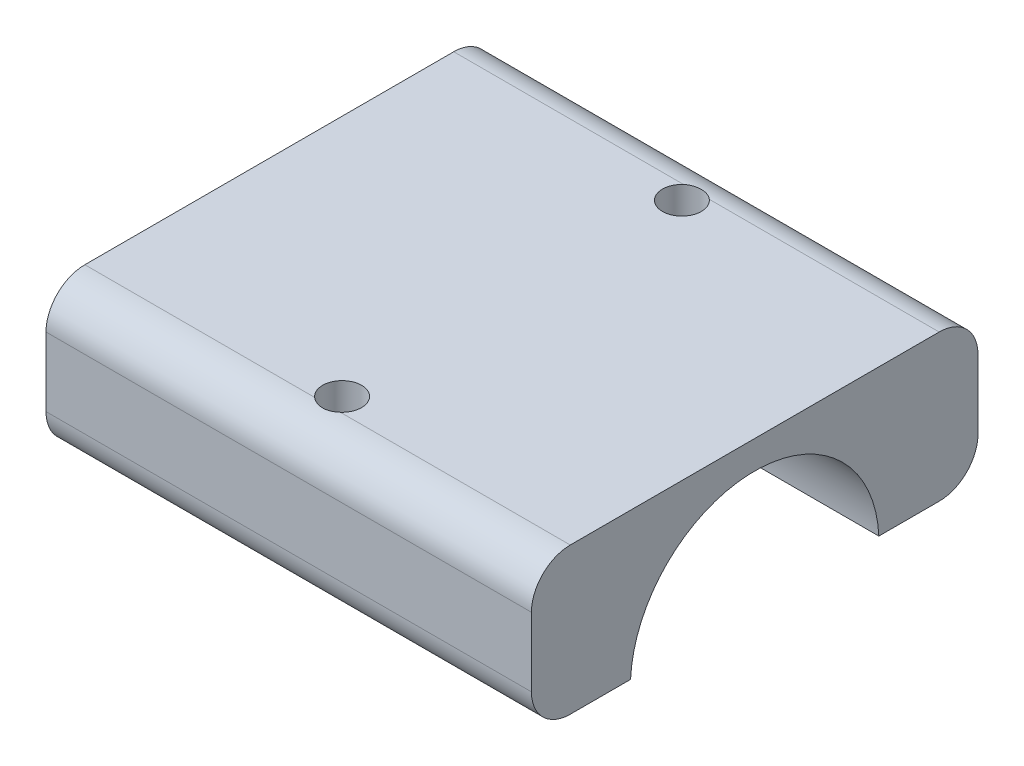
ISO-10303-21;
HEADER;
FILE_DESCRIPTION(('STEP AP214'),'2;1');
FILE_NAME('part.step','',(''),(''),'','','');
FILE_SCHEMA(('AUTOMOTIVE_DESIGN { 1 0 10303 214 1 1 1 1 }'));
ENDSEC;
DATA;
#1=APPLICATION_CONTEXT('core data for automotive mechanical design processes');
#2=APPLICATION_PROTOCOL_DEFINITION('international standard','automotive_design',2000,#1);
#3=PRODUCT_CONTEXT('',#1,'mechanical');
#4=PRODUCT('Part','Part','',(#3));
#5=PRODUCT_RELATED_PRODUCT_CATEGORY('part','',(#4));
#6=PRODUCT_DEFINITION_FORMATION('','',#4);
#7=PRODUCT_DEFINITION_CONTEXT('part definition',#1,'design');
#8=PRODUCT_DEFINITION('design','',#6,#7);
#9=PRODUCT_DEFINITION_SHAPE('','',#8);
#10=(LENGTH_UNIT() NAMED_UNIT(*) SI_UNIT(.MILLI.,.METRE.));
#11=(NAMED_UNIT(*) PLANE_ANGLE_UNIT() SI_UNIT($,.RADIAN.));
#12=(NAMED_UNIT(*) SI_UNIT($,.STERADIAN.) SOLID_ANGLE_UNIT());
#13=UNCERTAINTY_MEASURE_WITH_UNIT(LENGTH_MEASURE(1.E-05),#10,'distance_accuracy_value','');
#14=(GEOMETRIC_REPRESENTATION_CONTEXT(3) GLOBAL_UNCERTAINTY_ASSIGNED_CONTEXT((#13)) GLOBAL_UNIT_ASSIGNED_CONTEXT((#10,
#11,#12)) REPRESENTATION_CONTEXT('',''));
#15=CARTESIAN_POINT('',(0.,0.,0.));
#16=DIRECTION('',(0.,0.,1.));
#17=DIRECTION('',(1.,0.,0.));
#18=AXIS2_PLACEMENT_3D('',#15,#16,#17);
#19=CARTESIAN_POINT('',(25.,4.6,19.));
#20=DIRECTION('',(-1.,0.,0.));
#21=DIRECTION('',(0.,0.,1.));
#22=AXIS2_PLACEMENT_3D('',#19,#20,#21);
#23=CYLINDRICAL_SURFACE('',#22,4.);
#24=CARTESIAN_POINT('',(-16.6771243444677,0.6,19.));
#25=CARTESIAN_POINT('',(-16.7192506551599,0.600001174078135,19.0371518846942));
#26=CARTESIAN_POINT('',(-16.762919419632,0.600517310211942,19.0725074408913));
#27=CARTESIAN_POINT('',(-16.8530570336111,0.602290069309495,19.1394128146137));
#28=CARTESIAN_POINT('',(-16.8995254438069,0.603546576366918,19.1709632269095));
#29=CARTESIAN_POINT('',(-17.0425949485409,0.607988949122822,19.2595242307361));
#30=CARTESIAN_POINT('',(-17.1429753550835,0.611849230477293,19.3105458176302));
#31=CARTESIAN_POINT('',(-17.3508425605567,0.619327815303025,19.3950466501506));
#32=CARTESIAN_POINT('',(-17.4583309959682,0.622946062662406,19.4285218401249));
#33=CARTESIAN_POINT('',(-17.6774117692618,0.628466654639228,19.476994699731));
#34=CARTESIAN_POINT('',(-17.7890022984933,0.630369746260197,19.4920004144345));
#35=CARTESIAN_POINT('',(-18.0130484507786,0.631760391016297,19.5030985950613));
#36=CARTESIAN_POINT('',(-18.1255033675481,0.631249742329855,19.4992051403526));
#37=CARTESIAN_POINT('',(-18.3482139907828,0.628000437430483,19.4726447894183));
#38=CARTESIAN_POINT('',(-18.4584682827526,0.62526039266211,19.4499661929096));
#39=CARTESIAN_POINT('',(-18.673302325334,0.618598040792686,19.386581122766));
#40=CARTESIAN_POINT('',(-18.7778954111779,0.614678668676916,19.3459192872305));
#41=CARTESIAN_POINT('',(-18.9787287494616,0.607377499454782,19.2477239447546));
#42=CARTESIAN_POINT('',(-19.0749834093817,0.603994766357509,19.190220322867));
#43=CARTESIAN_POINT('',(-19.1929282707095,0.601347443085335,19.1056317655857));
#44=CARTESIAN_POINT('',(-19.2196776259688,0.60085739692341,19.0854065409097));
#45=CARTESIAN_POINT('',(-19.2720902769434,0.600183897303602,19.0436656427182));
#46=CARTESIAN_POINT('',(-19.2977550931037,0.599999999741905,19.0221518854178));
#47=CARTESIAN_POINT('',(-19.3228756555323,0.6,19.));
#48=B_SPLINE_CURVE_WITH_KNOTS('',3,(#24,#25,#26,#27,#28,#29,#30,#31,#32,#33,#34,#35,#36,#37,#38,
#39,#40,#41,#42,#43,#44,#45,#46,#47),.UNSPECIFIED.,.F.,.F.,(4,2,2,2,2,2,2,2,2,2,2,4),(0.,
0.16839344658215,0.336760537886409,0.673040899125642,1.00939895354341,1.34561044270104,
1.68157150188486,2.01774197113866,2.35308263893527,2.68783182694749,2.78841696352057,
2.88885606221804),.UNSPECIFIED.);
#49=CARTESIAN_POINT('',(-16.6771243444677,0.6,19.));
#50=VERTEX_POINT('',#49);
#51=CARTESIAN_POINT('',(-19.3228756555323,0.6,19.));
#52=VERTEX_POINT('',#51);
#53=EDGE_CURVE('E152',#50,#52,#48,.T.);
#54=ORIENTED_EDGE('',*,*,#53,.F.);
#55=DIRECTION('',(-1.,0.,0.));
#56=VECTOR('',#55,1.);
#57=CARTESIAN_POINT('',(25.,0.6,19.));
#58=LINE('',#57,#56);
#59=CARTESIAN_POINT('',(16.6771243444677,0.6,19.));
#60=VERTEX_POINT('',#59);
#61=EDGE_CURVE('E192',#60,#50,#58,.T.);
#62=ORIENTED_EDGE('',*,*,#61,.F.);
#63=CARTESIAN_POINT('',(19.3228756555323,0.6,19.));
#64=CARTESIAN_POINT('',(19.2807493448401,0.600001174078135,19.0371518846942));
#65=CARTESIAN_POINT('',(19.237080580368,0.600517310211942,19.0725074408913));
#66=CARTESIAN_POINT('',(19.1469429663889,0.602290069309495,19.1394128146137));
#67=CARTESIAN_POINT('',(19.1004745561931,0.603546576366918,19.1709632269095));
#68=CARTESIAN_POINT('',(18.9574050514591,0.607988949122821,19.2595242307361));
#69=CARTESIAN_POINT('',(18.8570246449165,0.611849230477293,19.3105458176302));
#70=CARTESIAN_POINT('',(18.6491574394433,0.619327815303025,19.3950466501506));
#71=CARTESIAN_POINT('',(18.5416690040318,0.622946062662407,19.4285218401249));
#72=CARTESIAN_POINT('',(18.3225882307382,0.628466654639228,19.476994699731));
#73=CARTESIAN_POINT('',(18.2109977015067,0.630369746260197,19.4920004144345));
#74=CARTESIAN_POINT('',(17.9869515492214,0.631760391016297,19.5030985950613));
#75=CARTESIAN_POINT('',(17.8744966324519,0.631249742329855,19.4992051403526));
#76=CARTESIAN_POINT('',(17.6517860092172,0.628000437430484,19.4726447894183));
#77=CARTESIAN_POINT('',(17.5415317172474,0.625260392662111,19.4499661929096));
#78=CARTESIAN_POINT('',(17.326697674666,0.618598040792686,19.386581122766));
#79=CARTESIAN_POINT('',(17.2221045888221,0.614678668676915,19.3459192872305));
#80=CARTESIAN_POINT('',(17.0212712505384,0.607377499454782,19.2477239447546));
#81=CARTESIAN_POINT('',(16.9250165906183,0.603994766357509,19.190220322867));
#82=CARTESIAN_POINT('',(16.8070717292905,0.601347443085334,19.1056317655857));
#83=CARTESIAN_POINT('',(16.7803223740312,0.60085739692341,19.0854065409097));
#84=CARTESIAN_POINT('',(16.7279097230566,0.600183897303602,19.0436656427182));
#85=CARTESIAN_POINT('',(16.7022449068963,0.599999999741905,19.0221518854178));
#86=CARTESIAN_POINT('',(16.6771243444677,0.6,19.));
#87=B_SPLINE_CURVE_WITH_KNOTS('',3,(#63,#64,#65,#66,#67,#68,#69,#70,#71,#72,#73,#74,#75,#76,#77,
#78,#79,#80,#81,#82,#83,#84,#85,#86),.UNSPECIFIED.,.F.,.F.,(4,2,2,2,2,2,2,2,2,2,2,4),(0.,
0.168393446582148,0.336760537886406,0.67304089912564,1.0093989535434,1.34561044270103,
1.68157150188486,2.01774197113865,2.35308263893527,2.68783182694749,2.78841696352058,
2.88885606221805),.UNSPECIFIED.);
#88=CARTESIAN_POINT('',(19.3228756555323,0.6,19.));
#89=VERTEX_POINT('',#88);
#90=EDGE_CURVE('E245',#89,#60,#87,.T.);
#91=ORIENTED_EDGE('',*,*,#90,.F.);
#92=CARTESIAN_POINT('',(25.,0.6,19.));
#93=VERTEX_POINT('',#92);
#94=EDGE_CURVE('E188',#93,#89,#58,.T.);
#95=ORIENTED_EDGE('',*,*,#94,.F.);
#96=CARTESIAN_POINT('',(25.,4.6,19.));
#97=DIRECTION('',(1.,0.,0.));
#98=DIRECTION('',(0.,0.,-1.));
#99=AXIS2_PLACEMENT_3D('',#96,#97,#98);
#100=CIRCLE('',#99,4.);
#101=CARTESIAN_POINT('',(25.,4.6,23.));
#102=VERTEX_POINT('',#101);
#103=EDGE_CURVE('E352',#102,#93,#100,.T.);
#104=ORIENTED_EDGE('',*,*,#103,.F.);
#105=DIRECTION('',(-1.,0.,0.));
#106=VECTOR('',#105,1.);
#107=CARTESIAN_POINT('',(25.,4.6,23.));
#108=LINE('',#107,#106);
#109=CARTESIAN_POINT('',(-25.,4.6,23.));
#110=VERTEX_POINT('',#109);
#111=EDGE_CURVE('E331',#102,#110,#108,.T.);
#112=ORIENTED_EDGE('',*,*,#111,.T.);
#113=CARTESIAN_POINT('',(-25.,4.6,19.));
#114=DIRECTION('',(1.,0.,0.));
#115=DIRECTION('',(0.,0.,-1.));
#116=AXIS2_PLACEMENT_3D('',#113,#114,#115);
#117=CIRCLE('',#116,4.);
#118=CARTESIAN_POINT('',(-25.,0.6,19.));
#119=VERTEX_POINT('',#118);
#120=EDGE_CURVE('E323',#110,#119,#117,.T.);
#121=ORIENTED_EDGE('',*,*,#120,.T.);
#122=EDGE_CURVE('E186',#52,#119,#58,.T.);
#123=ORIENTED_EDGE('',*,*,#122,.F.);
#124=EDGE_LOOP('',(#54,#62,#91,#95,#104,#112,#121,#123));
#125=FACE_BOUND('',#124,.T.);
#126=ADVANCED_FACE('F39',(#125),#23,.T.);
#127=CARTESIAN_POINT('',(25.,4.6,-19.));
#128=DIRECTION('',(-1.,0.,0.));
#129=DIRECTION('',(0.,0.,1.));
#130=AXIS2_PLACEMENT_3D('',#127,#128,#129);
#131=CYLINDRICAL_SURFACE('',#130,4.);
#132=CARTESIAN_POINT('',(16.6771243444677,0.6,-19.));
#133=CARTESIAN_POINT('',(16.7192506551599,0.600001174078135,-19.0371518846942));
#134=CARTESIAN_POINT('',(16.762919419632,0.600517310211942,-19.0725074408913));
#135=CARTESIAN_POINT('',(16.8530570336111,0.602290069309495,-19.1394128146137));
#136=CARTESIAN_POINT('',(16.8995254438069,0.603546576366918,-19.1709632269095));
#137=CARTESIAN_POINT('',(17.0425949485409,0.607988949122821,-19.2595242307361));
#138=CARTESIAN_POINT('',(17.1429753550835,0.611849230477293,-19.3105458176302));
#139=CARTESIAN_POINT('',(17.3508425605567,0.619327815303025,-19.3950466501506));
#140=CARTESIAN_POINT('',(17.4583309959682,0.622946062662407,-19.4285218401249));
#141=CARTESIAN_POINT('',(17.6774117692618,0.628466654639228,-19.476994699731));
#142=CARTESIAN_POINT('',(17.7890022984933,0.630369746260197,-19.4920004144345));
#143=CARTESIAN_POINT('',(18.0130484507786,0.631760391016297,-19.5030985950613));
#144=CARTESIAN_POINT('',(18.1255033675481,0.631249742329855,-19.4992051403526));
#145=CARTESIAN_POINT('',(18.3482139907828,0.628000437430484,-19.4726447894183));
#146=CARTESIAN_POINT('',(18.4584682827526,0.625260392662111,-19.4499661929096));
#147=CARTESIAN_POINT('',(18.673302325334,0.618598040792686,-19.386581122766));
#148=CARTESIAN_POINT('',(18.7778954111779,0.614678668676915,-19.3459192872305));
#149=CARTESIAN_POINT('',(18.9787287494616,0.607377499454782,-19.2477239447546));
#150=CARTESIAN_POINT('',(19.0749834093817,0.603994766357509,-19.190220322867));
#151=CARTESIAN_POINT('',(19.1929282707095,0.601347443085334,-19.1056317655857));
#152=CARTESIAN_POINT('',(19.2196776259688,0.60085739692341,-19.0854065409097));
#153=CARTESIAN_POINT('',(19.2720902769434,0.600183897303602,-19.0436656427182));
#154=CARTESIAN_POINT('',(19.2977550931037,0.599999999741905,-19.0221518854178));
#155=CARTESIAN_POINT('',(19.3228756555323,0.6,-19.));
#156=B_SPLINE_CURVE_WITH_KNOTS('',3,(#132,#133,#134,#135,#136,#137,#138,#139,#140,#141,#142,
#143,#144,#145,#146,#147,#148,#149,#150,#151,#152,#153,#154,#155),.UNSPECIFIED.,.F.,.F.,(4,2,2,
2,2,2,2,2,2,2,2,4),(0.,0.168393446582148,0.336760537886406,0.67304089912564,1.0093989535434,
1.34561044270103,1.68157150188486,2.01774197113865,2.35308263893527,2.68783182694749,
2.78841696352058,2.88885606221805),.UNSPECIFIED.);
#157=CARTESIAN_POINT('',(16.6771243444677,0.6,-19.));
#158=VERTEX_POINT('',#157);
#159=CARTESIAN_POINT('',(19.3228756555323,0.6,-19.));
#160=VERTEX_POINT('',#159);
#161=EDGE_CURVE('E200',#158,#160,#156,.T.);
#162=ORIENTED_EDGE('',*,*,#161,.F.);
#163=DIRECTION('',(-1.,0.,0.));
#164=VECTOR('',#163,1.);
#165=CARTESIAN_POINT('',(25.,0.6,-19.));
#166=LINE('',#165,#164);
#167=CARTESIAN_POINT('',(-16.6771243444677,0.6,-19.));
#168=VERTEX_POINT('',#167);
#169=EDGE_CURVE('E187',#158,#168,#166,.T.);
#170=ORIENTED_EDGE('',*,*,#169,.T.);
#171=CARTESIAN_POINT('',(-19.3228756555323,0.6,-19.));
#172=CARTESIAN_POINT('',(-19.2807493448401,0.600001174078135,-19.0371518846942));
#173=CARTESIAN_POINT('',(-19.237080580368,0.600517310211942,-19.0725074408913));
#174=CARTESIAN_POINT('',(-19.1469429663889,0.602290069309495,-19.1394128146137));
#175=CARTESIAN_POINT('',(-19.1004745561931,0.603546576366917,-19.1709632269095));
#176=CARTESIAN_POINT('',(-18.9574050514591,0.607988949122821,-19.2595242307361));
#177=CARTESIAN_POINT('',(-18.8570246449165,0.611849230477293,-19.3105458176302));
#178=CARTESIAN_POINT('',(-18.6491574394433,0.619327815303025,-19.3950466501506));
#179=CARTESIAN_POINT('',(-18.5416690040318,0.622946062662407,-19.4285218401249));
#180=CARTESIAN_POINT('',(-18.3225882307382,0.628466654639228,-19.476994699731));
#181=CARTESIAN_POINT('',(-18.2109977015067,0.630369746260197,-19.4920004144345));
#182=CARTESIAN_POINT('',(-17.9869515492214,0.631760391016297,-19.5030985950613));
#183=CARTESIAN_POINT('',(-17.8744966324519,0.631249742329855,-19.4992051403526));
#184=CARTESIAN_POINT('',(-17.6517860092172,0.628000437430484,-19.4726447894183));
#185=CARTESIAN_POINT('',(-17.5415317172474,0.625260392662111,-19.4499661929096));
#186=CARTESIAN_POINT('',(-17.326697674666,0.618598040792687,-19.386581122766));
#187=CARTESIAN_POINT('',(-17.2221045888221,0.614678668676915,-19.3459192872305));
#188=CARTESIAN_POINT('',(-17.0212712505384,0.607377499454782,-19.2477239447546));
#189=CARTESIAN_POINT('',(-16.9250165906183,0.60399476635751,-19.190220322867));
#190=CARTESIAN_POINT('',(-16.8070717292905,0.601347443085335,-19.1056317655857));
#191=CARTESIAN_POINT('',(-16.7803223740312,0.60085739692341,-19.0854065409097));
#192=CARTESIAN_POINT('',(-16.7279097230566,0.600183897303602,-19.0436656427182));
#193=CARTESIAN_POINT('',(-16.7022449068963,0.599999999741905,-19.0221518854178));
#194=CARTESIAN_POINT('',(-16.6771243444677,0.6,-19.));
#195=B_SPLINE_CURVE_WITH_KNOTS('',3,(#171,#172,#173,#174,#175,#176,#177,#178,#179,#180,#181,
#182,#183,#184,#185,#186,#187,#188,#189,#190,#191,#192,#193,#194),.UNSPECIFIED.,.F.,.F.,(4,2,2,
2,2,2,2,2,2,2,2,4),(0.,0.168393446582145,0.336760537886403,0.673040899125637,1.0093989535434,
1.34561044270103,1.68157150188485,2.01774197113865,2.35308263893526,2.68783182694748,
2.78841696352056,2.88885606221804),.UNSPECIFIED.);
#196=CARTESIAN_POINT('',(-19.3228756555323,0.6,-19.));
#197=VERTEX_POINT('',#196);
#198=EDGE_CURVE('E191',#197,#168,#195,.T.);
#199=ORIENTED_EDGE('',*,*,#198,.F.);
#200=CARTESIAN_POINT('',(-25.,0.6,-19.));
#201=VERTEX_POINT('',#200);
#202=EDGE_CURVE('E182',#197,#201,#166,.T.);
#203=ORIENTED_EDGE('',*,*,#202,.T.);
#204=CARTESIAN_POINT('',(-25.,4.6,-19.));
#205=DIRECTION('',(1.,0.,0.));
#206=DIRECTION('',(0.,0.,-1.));
#207=AXIS2_PLACEMENT_3D('',#204,#205,#206);
#208=CIRCLE('',#207,4.);
#209=CARTESIAN_POINT('',(-25.,4.6,-23.));
#210=VERTEX_POINT('',#209);
#211=EDGE_CURVE('E325',#201,#210,#208,.T.);
#212=ORIENTED_EDGE('',*,*,#211,.T.);
#213=DIRECTION('',(-1.,0.,0.));
#214=VECTOR('',#213,1.);
#215=CARTESIAN_POINT('',(25.,4.6,-23.));
#216=LINE('',#215,#214);
#217=CARTESIAN_POINT('',(25.,4.6,-23.));
#218=VERTEX_POINT('',#217);
#219=EDGE_CURVE('E179',#218,#210,#216,.T.);
#220=ORIENTED_EDGE('',*,*,#219,.F.);
#221=CARTESIAN_POINT('',(25.,4.6,-19.));
#222=DIRECTION('',(1.,0.,0.));
#223=DIRECTION('',(0.,0.,-1.));
#224=AXIS2_PLACEMENT_3D('',#221,#222,#223);
#225=CIRCLE('',#224,4.);
#226=CARTESIAN_POINT('',(25.,0.6,-19.));
#227=VERTEX_POINT('',#226);
#228=EDGE_CURVE('E364',#227,#218,#225,.T.);
#229=ORIENTED_EDGE('',*,*,#228,.F.);
#230=EDGE_CURVE('E183',#227,#160,#166,.T.);
#231=ORIENTED_EDGE('',*,*,#230,.T.);
#232=EDGE_LOOP('',(#162,#170,#199,#203,#212,#220,#229,#231));
#233=FACE_BOUND('',#232,.T.);
#234=ADVANCED_FACE('F207',(#233),#131,.T.);
#235=CARTESIAN_POINT('',(25.,0.6,19.));
#236=DIRECTION('',(0.,1.,0.));
#237=DIRECTION('',(0.,0.,1.));
#238=AXIS2_PLACEMENT_3D('',#235,#236,#237);
#239=PLANE('',#238);
#240=CARTESIAN_POINT('',(-18.,0.6,17.5));
#241=DIRECTION('',(0.,1.,0.));
#242=DIRECTION('',(0.,0.,1.));
#243=AXIS2_PLACEMENT_3D('',#240,#241,#242);
#244=CIRCLE('',#243,2.);
#245=EDGE_CURVE('E311',#50,#52,#244,.T.);
#246=ORIENTED_EDGE('',*,*,#245,.T.);
#247=ORIENTED_EDGE('',*,*,#122,.T.);
#248=DIRECTION('',(0.,0.,-1.));
#249=VECTOR('',#248,1.);
#250=CARTESIAN_POINT('',(-25.,0.6,19.));
#251=LINE('',#250,#249);
#252=CARTESIAN_POINT('',(-25.,0.6,12.7859297667397));
#253=VERTEX_POINT('',#252);
#254=EDGE_CURVE('E316',#119,#253,#251,.T.);
#255=ORIENTED_EDGE('',*,*,#254,.T.);
#256=DIRECTION('',(1.,0.,0.));
#257=VECTOR('',#256,1.);
#258=CARTESIAN_POINT('',(-25.,0.6,12.7859297667397));
#259=LINE('',#258,#257);
#260=CARTESIAN_POINT('',(25.,0.6,12.7859297667397));
#261=VERTEX_POINT('',#260);
#262=EDGE_CURVE('E332',#253,#261,#259,.T.);
#263=ORIENTED_EDGE('',*,*,#262,.T.);
#264=DIRECTION('',(0.,0.,-1.));
#265=VECTOR('',#264,1.);
#266=CARTESIAN_POINT('',(25.,0.6,19.));
#267=LINE('',#266,#265);
#268=EDGE_CURVE('E366',#93,#261,#267,.T.);
#269=ORIENTED_EDGE('',*,*,#268,.F.);
#270=ORIENTED_EDGE('',*,*,#94,.T.);
#271=CARTESIAN_POINT('',(18.,0.6,17.5));
#272=DIRECTION('',(0.,1.,0.));
#273=DIRECTION('',(0.,0.,1.));
#274=AXIS2_PLACEMENT_3D('',#271,#272,#273);
#275=CIRCLE('',#274,2.);
#276=EDGE_CURVE('E312',#89,#60,#275,.T.);
#277=ORIENTED_EDGE('',*,*,#276,.T.);
#278=ORIENTED_EDGE('',*,*,#61,.T.);
#279=EDGE_LOOP('',(#246,#247,#255,#263,#269,#270,#277,#278));
#280=FACE_BOUND('',#279,.T.);
#281=ADVANCED_FACE('F292',(#280),#239,.F.);
#282=CARTESIAN_POINT('',(18.,0.6,-17.5));
#283=DIRECTION('',(0.,1.,0.));
#284=DIRECTION('',(0.,0.,1.));
#285=AXIS2_PLACEMENT_3D('',#282,#283,#284);
#286=CIRCLE('',#285,2.);
#287=EDGE_CURVE('E378',#158,#160,#286,.T.);
#288=ORIENTED_EDGE('',*,*,#287,.T.);
#289=ORIENTED_EDGE('',*,*,#230,.F.);
#290=CARTESIAN_POINT('',(25.,0.6,-12.7859297667397));
#291=VERTEX_POINT('',#290);
#292=EDGE_CURVE('E369',#291,#227,#267,.T.);
#293=ORIENTED_EDGE('',*,*,#292,.F.);
#294=DIRECTION('',(1.,0.,0.));
#295=VECTOR('',#294,1.);
#296=CARTESIAN_POINT('',(-25.,0.6,-12.7859297667397));
#297=LINE('',#296,#295);
#298=CARTESIAN_POINT('',(-25.,0.6,-12.7859297667397));
#299=VERTEX_POINT('',#298);
#300=EDGE_CURVE('E335',#291,#299,#297,.F.);
#301=ORIENTED_EDGE('',*,*,#300,.T.);
#302=EDGE_CURVE('E326',#299,#201,#251,.T.);
#303=ORIENTED_EDGE('',*,*,#302,.T.);
#304=ORIENTED_EDGE('',*,*,#202,.F.);
#305=CARTESIAN_POINT('',(-18.,0.6,-17.5));
#306=DIRECTION('',(0.,1.,0.));
#307=DIRECTION('',(0.,0.,1.));
#308=AXIS2_PLACEMENT_3D('',#305,#306,#307);
#309=CIRCLE('',#308,2.);
#310=EDGE_CURVE('E278',#197,#168,#309,.T.);
#311=ORIENTED_EDGE('',*,*,#310,.T.);
#312=ORIENTED_EDGE('',*,*,#169,.F.);
#313=EDGE_LOOP('',(#288,#289,#293,#301,#303,#304,#311,#312));
#314=FACE_BOUND('',#313,.T.);
#315=ADVANCED_FACE('F286',(#314),#239,.F.);
#316=CARTESIAN_POINT('',(25.,4.6,-23.));
#317=DIRECTION('',(0.,0.,1.));
#318=DIRECTION('',(1.,0.,0.));
#319=AXIS2_PLACEMENT_3D('',#316,#317,#318);
#320=PLANE('',#319);
#321=DIRECTION('',(0.,1.,0.));
#322=VECTOR('',#321,1.);
#323=CARTESIAN_POINT('',(-25.,4.6,-23.));
#324=LINE('',#323,#322);
#325=CARTESIAN_POINT('',(-25.,11.7,-23.));
#326=VERTEX_POINT('',#325);
#327=EDGE_CURVE('E342',#210,#326,#324,.T.);
#328=ORIENTED_EDGE('',*,*,#327,.T.);
#329=DIRECTION('',(-1.,0.,0.));
#330=VECTOR('',#329,1.);
#331=CARTESIAN_POINT('',(25.,11.7,-23.));
#332=LINE('',#331,#330);
#333=CARTESIAN_POINT('',(25.,11.7,-23.));
#334=VERTEX_POINT('',#333);
#335=EDGE_CURVE('E176',#334,#326,#332,.T.);
#336=ORIENTED_EDGE('',*,*,#335,.F.);
#337=DIRECTION('',(0.,1.,0.));
#338=VECTOR('',#337,1.);
#339=CARTESIAN_POINT('',(25.,4.6,-23.));
#340=LINE('',#339,#338);
#341=EDGE_CURVE('E362',#218,#334,#340,.T.);
#342=ORIENTED_EDGE('',*,*,#341,.F.);
#343=ORIENTED_EDGE('',*,*,#219,.T.);
#344=EDGE_LOOP('',(#328,#336,#342,#343));
#345=FACE_BOUND('',#344,.T.);
#346=ADVANCED_FACE('F283',(#345),#320,.F.);
#347=CARTESIAN_POINT('',(25.,11.7,-19.));
#348=DIRECTION('',(-1.,0.,0.));
#349=DIRECTION('',(0.,0.,1.));
#350=AXIS2_PLACEMENT_3D('',#347,#348,#349);
#351=CYLINDRICAL_SURFACE('',#350,4.);
#352=DIRECTION('',(-1.,0.,0.));
#353=VECTOR('',#352,1.);
#354=CARTESIAN_POINT('',(25.,15.7,-19.));
#355=LINE('',#354,#353);
#356=CARTESIAN_POINT('',(-1.3228756555323,15.7,-19.));
#357=VERTEX_POINT('',#356);
#358=CARTESIAN_POINT('',(-25.,15.7,-19.));
#359=VERTEX_POINT('',#358);
#360=EDGE_CURVE('E167',#357,#359,#355,.T.);
#361=ORIENTED_EDGE('',*,*,#360,.F.);
#362=CARTESIAN_POINT('',(-1.3228756555323,15.7,-19.));
#363=CARTESIAN_POINT('',(-1.28074934484013,15.6999988259219,-19.0371518846942));
#364=CARTESIAN_POINT('',(-1.23708058036804,15.6994826897881,-19.0725074408913));
#365=CARTESIAN_POINT('',(-1.14694296638886,15.6977099306905,-19.1394128146137));
#366=CARTESIAN_POINT('',(-1.1004745561931,15.6964534236331,-19.1709632269095));
#367=CARTESIAN_POINT('',(-0.957405051459105,15.6920110508772,-19.2595242307361));
#368=CARTESIAN_POINT('',(-0.857024644916495,15.6881507695227,-19.3105458176302));
#369=CARTESIAN_POINT('',(-0.649157439443299,15.680672184697,-19.3950466501506));
#370=CARTESIAN_POINT('',(-0.541669004031822,15.6770539373376,-19.4285218401249));
#371=CARTESIAN_POINT('',(-0.322588230738185,15.6715333453608,-19.476994699731));
#372=CARTESIAN_POINT('',(-0.210997701506752,15.6696302537398,-19.4920004144345));
#373=CARTESIAN_POINT('',(0.013048450778615,15.6682396089837,-19.5030985950613));
#374=CARTESIAN_POINT('',(0.12550336754809,15.6687502576701,-19.4992051403526));
#375=CARTESIAN_POINT('',(0.348213990782797,15.6719995625695,-19.4726447894183));
#376=CARTESIAN_POINT('',(0.458468282752597,15.6747396073379,-19.4499661929096));
#377=CARTESIAN_POINT('',(0.673302325334016,15.6814019592073,-19.386581122766));
#378=CARTESIAN_POINT('',(0.777895411177892,15.6853213313231,-19.3459192872305));
#379=CARTESIAN_POINT('',(0.978728749461572,15.6926225005452,-19.2477239447546));
#380=CARTESIAN_POINT('',(1.07498340938166,15.6960052336425,-19.190220322867));
#381=CARTESIAN_POINT('',(1.19292827070952,15.6986525569147,-19.1056317655857));
#382=CARTESIAN_POINT('',(1.21967762596878,15.6991426030766,-19.0854065409097));
#383=CARTESIAN_POINT('',(1.27209027694341,15.6998161026964,-19.0436656427182));
#384=CARTESIAN_POINT('',(1.29775509310374,15.7000000002581,-19.0221518854178));
#385=CARTESIAN_POINT('',(1.3228756555323,15.7,-19.));
#386=B_SPLINE_CURVE_WITH_KNOTS('',3,(#362,#363,#364,#365,#366,#367,#368,#369,#370,#371,#372,
#373,#374,#375,#376,#377,#378,#379,#380,#381,#382,#383,#384,#385),.UNSPECIFIED.,.F.,.F.,(4,2,2,
2,2,2,2,2,2,2,2,4),(0.,0.168393446582148,0.336760537886405,0.673040899125638,1.0093989535434,
1.34561044270103,1.68157150188485,2.01774197113865,2.35308263893526,2.68783182694749,
2.78841696352058,2.88885606221805),.UNSPECIFIED.);
#387=CARTESIAN_POINT('',(1.3228756555323,15.7,-19.));
#388=VERTEX_POINT('',#387);
#389=EDGE_CURVE('E53',#357,#388,#386,.T.);
#390=ORIENTED_EDGE('',*,*,#389,.T.);
#391=CARTESIAN_POINT('',(25.,15.7,-19.));
#392=VERTEX_POINT('',#391);
#393=EDGE_CURVE('E169',#392,#388,#355,.T.);
#394=ORIENTED_EDGE('',*,*,#393,.F.);
#395=CARTESIAN_POINT('',(25.,11.7,-19.));
#396=DIRECTION('',(1.,0.,0.));
#397=DIRECTION('',(0.,0.,-1.));
#398=AXIS2_PLACEMENT_3D('',#395,#396,#397);
#399=CIRCLE('',#398,4.);
#400=EDGE_CURVE('E358',#334,#392,#399,.T.);
#401=ORIENTED_EDGE('',*,*,#400,.F.);
#402=ORIENTED_EDGE('',*,*,#335,.T.);
#403=CARTESIAN_POINT('',(-25.,11.7,-19.));
#404=DIRECTION('',(1.,0.,0.));
#405=DIRECTION('',(0.,0.,-1.));
#406=AXIS2_PLACEMENT_3D('',#403,#404,#405);
#407=CIRCLE('',#406,4.);
#408=EDGE_CURVE('E344',#326,#359,#407,.T.);
#409=ORIENTED_EDGE('',*,*,#408,.T.);
#410=EDGE_LOOP('',(#361,#390,#394,#401,#402,#409));
#411=FACE_BOUND('',#410,.T.);
#412=ADVANCED_FACE('F280',(#411),#351,.T.);
#413=CARTESIAN_POINT('',(25.,15.7,-19.));
#414=DIRECTION('',(0.,-1.,0.));
#415=DIRECTION('',(0.,0.,-1.));
#416=AXIS2_PLACEMENT_3D('',#413,#414,#415);
#417=PLANE('',#416);
#418=DIRECTION('',(-1.,0.,0.));
#419=VECTOR('',#418,1.);
#420=CARTESIAN_POINT('',(25.,15.7,19.));
#421=LINE('',#420,#419);
#422=CARTESIAN_POINT('',(-1.3228756555323,15.7,19.));
#423=VERTEX_POINT('',#422);
#424=CARTESIAN_POINT('',(-25.,15.7,19.));
#425=VERTEX_POINT('',#424);
#426=EDGE_CURVE('E160',#423,#425,#421,.T.);
#427=ORIENTED_EDGE('',*,*,#426,.F.);
#428=CARTESIAN_POINT('',(0.,15.7,17.5));
#429=DIRECTION('',(0.,1.,0.));
#430=DIRECTION('',(0.,0.,1.));
#431=AXIS2_PLACEMENT_3D('',#428,#429,#430);
#432=CIRCLE('',#431,2.);
#433=CARTESIAN_POINT('',(1.3228756555323,15.7,19.));
#434=VERTEX_POINT('',#433);
#435=EDGE_CURVE('E59',#434,#423,#432,.T.);
#436=ORIENTED_EDGE('',*,*,#435,.F.);
#437=CARTESIAN_POINT('',(25.,15.7,19.));
#438=VERTEX_POINT('',#437);
#439=EDGE_CURVE('E157',#438,#434,#421,.T.);
#440=ORIENTED_EDGE('',*,*,#439,.F.);
#441=DIRECTION('',(0.,0.,1.));
#442=VECTOR('',#441,1.);
#443=CARTESIAN_POINT('',(25.,15.7,-19.));
#444=LINE('',#443,#442);
#445=EDGE_CURVE('E357',#392,#438,#444,.T.);
#446=ORIENTED_EDGE('',*,*,#445,.F.);
#447=ORIENTED_EDGE('',*,*,#393,.T.);
#448=CARTESIAN_POINT('',(0.,15.7,-17.5));
#449=DIRECTION('',(0.,-1.,0.));
#450=DIRECTION('',(0.,0.,-1.));
#451=AXIS2_PLACEMENT_3D('',#448,#449,#450);
#452=CIRCLE('',#451,2.);
#453=EDGE_CURVE('E11',#388,#357,#452,.T.);
#454=ORIENTED_EDGE('',*,*,#453,.T.);
#455=ORIENTED_EDGE('',*,*,#360,.T.);
#456=DIRECTION('',(0.,0.,1.));
#457=VECTOR('',#456,1.);
#458=CARTESIAN_POINT('',(-25.,15.7,-19.));
#459=LINE('',#458,#457);
#460=EDGE_CURVE('E347',#359,#425,#459,.T.);
#461=ORIENTED_EDGE('',*,*,#460,.T.);
#462=EDGE_LOOP('',(#427,#436,#440,#446,#447,#454,#455,#461));
#463=FACE_BOUND('',#462,.T.);
#464=ADVANCED_FACE('F155',(#463),#417,.F.);
#465=CARTESIAN_POINT('',(25.,11.7,19.));
#466=DIRECTION('',(-1.,0.,0.));
#467=DIRECTION('',(0.,0.,1.));
#468=AXIS2_PLACEMENT_3D('',#465,#466,#467);
#469=CYLINDRICAL_SURFACE('',#468,4.);
#470=ORIENTED_EDGE('',*,*,#439,.T.);
#471=CARTESIAN_POINT('',(1.3228756555323,15.7,19.));
#472=CARTESIAN_POINT('',(1.28074934484013,15.6999988259219,19.0371518846942));
#473=CARTESIAN_POINT('',(1.23708058036804,15.6994826897881,19.0725074408913));
#474=CARTESIAN_POINT('',(1.14694296638886,15.6977099306905,19.1394128146137));
#475=CARTESIAN_POINT('',(1.1004745561931,15.6964534236331,19.1709632269095));
#476=CARTESIAN_POINT('',(0.957405051459105,15.6920110508772,19.2595242307361));
#477=CARTESIAN_POINT('',(0.857024644916495,15.6881507695227,19.3105458176302));
#478=CARTESIAN_POINT('',(0.649157439443299,15.680672184697,19.3950466501506));
#479=CARTESIAN_POINT('',(0.541669004031822,15.6770539373376,19.4285218401249));
#480=CARTESIAN_POINT('',(0.322588230738185,15.6715333453608,19.476994699731));
#481=CARTESIAN_POINT('',(0.210997701506752,15.6696302537398,19.4920004144345));
#482=CARTESIAN_POINT('',(-0.013048450778615,15.6682396089837,19.5030985950613));
#483=CARTESIAN_POINT('',(-0.12550336754809,15.6687502576701,19.4992051403526));
#484=CARTESIAN_POINT('',(-0.348213990782797,15.6719995625695,19.4726447894183));
#485=CARTESIAN_POINT('',(-0.458468282752597,15.6747396073379,19.4499661929096));
#486=CARTESIAN_POINT('',(-0.673302325334016,15.6814019592073,19.386581122766));
#487=CARTESIAN_POINT('',(-0.777895411177892,15.6853213313231,19.3459192872305));
#488=CARTESIAN_POINT('',(-0.978728749461572,15.6926225005452,19.2477239447546));
#489=CARTESIAN_POINT('',(-1.07498340938166,15.6960052336425,19.190220322867));
#490=CARTESIAN_POINT('',(-1.19292827070952,15.6986525569147,19.1056317655857));
#491=CARTESIAN_POINT('',(-1.21967762596878,15.6991426030766,19.0854065409097));
#492=CARTESIAN_POINT('',(-1.27209027694341,15.6998161026964,19.0436656427182));
#493=CARTESIAN_POINT('',(-1.29775509310374,15.7000000002581,19.0221518854178));
#494=CARTESIAN_POINT('',(-1.3228756555323,15.7,19.));
#495=B_SPLINE_CURVE_WITH_KNOTS('',3,(#471,#472,#473,#474,#475,#476,#477,#478,#479,#480,#481,
#482,#483,#484,#485,#486,#487,#488,#489,#490,#491,#492,#493,#494),.UNSPECIFIED.,.F.,.F.,(4,2,2,
2,2,2,2,2,2,2,2,4),(0.,0.168393446582148,0.336760537886405,0.673040899125638,1.0093989535434,
1.34561044270103,1.68157150188485,2.01774197113865,2.35308263893526,2.68783182694749,
2.78841696352058,2.88885606221805),.UNSPECIFIED.);
#496=EDGE_CURVE('E47',#434,#423,#495,.T.);
#497=ORIENTED_EDGE('',*,*,#496,.T.);
#498=ORIENTED_EDGE('',*,*,#426,.T.);
#499=CARTESIAN_POINT('',(-25.,11.7,19.));
#500=DIRECTION('',(1.,0.,0.));
#501=DIRECTION('',(0.,0.,-1.));
#502=AXIS2_PLACEMENT_3D('',#499,#500,#501);
#503=CIRCLE('',#502,4.);
#504=CARTESIAN_POINT('',(-25.,11.7,23.));
#505=VERTEX_POINT('',#504);
#506=EDGE_CURVE('E349',#425,#505,#503,.T.);
#507=ORIENTED_EDGE('',*,*,#506,.T.);
#508=DIRECTION('',(-1.,0.,0.));
#509=VECTOR('',#508,1.);
#510=CARTESIAN_POINT('',(25.,11.7,23.));
#511=LINE('',#510,#509);
#512=CARTESIAN_POINT('',(25.,11.7,23.));
#513=VERTEX_POINT('',#512);
#514=EDGE_CURVE('E171',#513,#505,#511,.T.);
#515=ORIENTED_EDGE('',*,*,#514,.F.);
#516=CARTESIAN_POINT('',(25.,11.7,19.));
#517=DIRECTION('',(1.,0.,0.));
#518=DIRECTION('',(0.,0.,-1.));
#519=AXIS2_PLACEMENT_3D('',#516,#517,#518);
#520=CIRCLE('',#519,4.);
#521=EDGE_CURVE('E166',#438,#513,#520,.T.);
#522=ORIENTED_EDGE('',*,*,#521,.F.);
#523=EDGE_LOOP('',(#470,#497,#498,#507,#515,#522));
#524=FACE_BOUND('',#523,.T.);
#525=ADVANCED_FACE('F164',(#524),#469,.T.);
#526=CARTESIAN_POINT('',(25.,11.7,23.));
#527=DIRECTION('',(0.,0.,-1.));
#528=DIRECTION('',(-1.,0.,0.));
#529=AXIS2_PLACEMENT_3D('',#526,#527,#528);
#530=PLANE('',#529);
#531=DIRECTION('',(0.,-1.,0.));
#532=VECTOR('',#531,1.);
#533=CARTESIAN_POINT('',(-25.,11.7,23.));
#534=LINE('',#533,#532);
#535=EDGE_CURVE('E351',#505,#110,#534,.T.);
#536=ORIENTED_EDGE('',*,*,#535,.T.);
#537=ORIENTED_EDGE('',*,*,#111,.F.);
#538=DIRECTION('',(0.,-1.,0.));
#539=VECTOR('',#538,1.);
#540=CARTESIAN_POINT('',(25.,11.7,23.));
#541=LINE('',#540,#539);
#542=EDGE_CURVE('E338',#513,#102,#541,.T.);
#543=ORIENTED_EDGE('',*,*,#542,.F.);
#544=ORIENTED_EDGE('',*,*,#514,.T.);
#545=EDGE_LOOP('',(#536,#537,#543,#544));
#546=FACE_BOUND('',#545,.T.);
#547=ADVANCED_FACE('F425',(#546),#530,.F.);
#548=CARTESIAN_POINT('',(25.,4.6,19.));
#549=DIRECTION('',(1.,0.,0.));
#550=DIRECTION('',(0.,0.,-1.));
#551=AXIS2_PLACEMENT_3D('',#548,#549,#550);
#552=PLANE('',#551);
#553=CARTESIAN_POINT('',(25.,0.,0.));
#554=DIRECTION('',(1.,0.,0.));
#555=DIRECTION('',(0.,0.,-1.));
#556=AXIS2_PLACEMENT_3D('',#553,#554,#555);
#557=CIRCLE('',#556,12.8);
#558=EDGE_CURVE('E374',#291,#261,#557,.T.);
#559=ORIENTED_EDGE('',*,*,#558,.F.);
#560=ORIENTED_EDGE('',*,*,#292,.T.);
#561=ORIENTED_EDGE('',*,*,#228,.T.);
#562=ORIENTED_EDGE('',*,*,#341,.T.);
#563=ORIENTED_EDGE('',*,*,#400,.T.);
#564=ORIENTED_EDGE('',*,*,#445,.T.);
#565=ORIENTED_EDGE('',*,*,#521,.T.);
#566=ORIENTED_EDGE('',*,*,#542,.T.);
#567=ORIENTED_EDGE('',*,*,#103,.T.);
#568=ORIENTED_EDGE('',*,*,#268,.T.);
#569=EDGE_LOOP('',(#559,#560,#561,#562,#563,#564,#565,#566,#567,#568));
#570=FACE_BOUND('',#569,.T.);
#571=ADVANCED_FACE('F410',(#570),#552,.T.);
#572=CARTESIAN_POINT('',(-25.,4.6,19.));
#573=DIRECTION('',(1.,0.,0.));
#574=DIRECTION('',(0.,0.,-1.));
#575=AXIS2_PLACEMENT_3D('',#572,#573,#574);
#576=PLANE('',#575);
#577=ORIENTED_EDGE('',*,*,#302,.F.);
#578=CARTESIAN_POINT('',(-25.,0.,0.));
#579=DIRECTION('',(1.,0.,0.));
#580=DIRECTION('',(0.,0.,-1.));
#581=AXIS2_PLACEMENT_3D('',#578,#579,#580);
#582=CIRCLE('',#581,12.8);
#583=EDGE_CURVE('E324',#299,#253,#582,.T.);
#584=ORIENTED_EDGE('',*,*,#583,.T.);
#585=ORIENTED_EDGE('',*,*,#254,.F.);
#586=ORIENTED_EDGE('',*,*,#120,.F.);
#587=ORIENTED_EDGE('',*,*,#535,.F.);
#588=ORIENTED_EDGE('',*,*,#506,.F.);
#589=ORIENTED_EDGE('',*,*,#460,.F.);
#590=ORIENTED_EDGE('',*,*,#408,.F.);
#591=ORIENTED_EDGE('',*,*,#327,.F.);
#592=ORIENTED_EDGE('',*,*,#211,.F.);
#593=EDGE_LOOP('',(#577,#584,#585,#586,#587,#588,#589,#590,#591,#592));
#594=FACE_BOUND('',#593,.T.);
#595=ADVANCED_FACE('F321',(#594),#576,.F.);
#596=CARTESIAN_POINT('',(-25.,0.,0.));
#597=DIRECTION('',(1.,0.,0.));
#598=DIRECTION('',(0.,0.,-1.));
#599=AXIS2_PLACEMENT_3D('',#596,#597,#598);
#600=CYLINDRICAL_SURFACE('',#599,12.8);
#601=ORIENTED_EDGE('',*,*,#583,.F.);
#602=ORIENTED_EDGE('',*,*,#300,.F.);
#603=ORIENTED_EDGE('',*,*,#558,.T.);
#604=ORIENTED_EDGE('',*,*,#262,.F.);
#605=EDGE_LOOP('',(#601,#602,#603,#604));
#606=FACE_BOUND('',#605,.T.);
#607=ADVANCED_FACE('F216',(#606),#600,.F.);
#608=CARTESIAN_POINT('',(-18.,8.1,-17.5));
#609=DIRECTION('',(0.,-1.,0.));
#610=DIRECTION('',(0.,0.,-1.));
#611=AXIS2_PLACEMENT_3D('',#608,#609,#610);
#612=CYLINDRICAL_SURFACE('',#611,2.);
#613=CARTESIAN_POINT('',(-18.,8.1,-17.5));
#614=DIRECTION('',(0.,1.,0.));
#615=DIRECTION('',(0.,0.,1.));
#616=AXIS2_PLACEMENT_3D('',#613,#614,#615);
#617=CIRCLE('',#616,2.);
#618=CARTESIAN_POINT('',(-18.,8.1,-15.5));
#619=VERTEX_POINT('',#618);
#620=EDGE_CURVE('E277',#619,#619,#617,.T.);
#621=ORIENTED_EDGE('',*,*,#620,.T.);
#622=EDGE_LOOP('',(#621));
#623=FACE_BOUND('',#622,.T.);
#624=ORIENTED_EDGE('',*,*,#198,.T.);
#625=ORIENTED_EDGE('',*,*,#310,.F.);
#626=EDGE_LOOP('',(#624,#625));
#627=FACE_BOUND('',#626,.T.);
#628=ADVANCED_FACE('F210',(#623,#627),#612,.F.);
#629=CARTESIAN_POINT('',(-18.,8.1,-17.5));
#630=DIRECTION('',(0.,1.,0.));
#631=DIRECTION('',(0.,0.,1.));
#632=AXIS2_PLACEMENT_3D('',#629,#630,#631);
#633=PLANE('',#632);
#634=ORIENTED_EDGE('',*,*,#620,.F.);
#635=EDGE_LOOP('',(#634));
#636=FACE_BOUND('',#635,.T.);
#637=ADVANCED_FACE('F215',(#636),#633,.F.);
#638=CARTESIAN_POINT('',(18.,8.1,-17.5));
#639=DIRECTION('',(0.,-1.,0.));
#640=DIRECTION('',(0.,0.,-1.));
#641=AXIS2_PLACEMENT_3D('',#638,#639,#640);
#642=CYLINDRICAL_SURFACE('',#641,2.);
#643=CARTESIAN_POINT('',(18.,8.1,-17.5));
#644=DIRECTION('',(0.,1.,0.));
#645=DIRECTION('',(0.,0.,1.));
#646=AXIS2_PLACEMENT_3D('',#643,#644,#645);
#647=CIRCLE('',#646,2.);
#648=CARTESIAN_POINT('',(18.,8.1,-15.5));
#649=VERTEX_POINT('',#648);
#650=EDGE_CURVE('E385',#649,#649,#647,.T.);
#651=ORIENTED_EDGE('',*,*,#650,.T.);
#652=EDGE_LOOP('',(#651));
#653=FACE_BOUND('',#652,.T.);
#654=ORIENTED_EDGE('',*,*,#161,.T.);
#655=ORIENTED_EDGE('',*,*,#287,.F.);
#656=EDGE_LOOP('',(#654,#655));
#657=FACE_BOUND('',#656,.T.);
#658=ADVANCED_FACE('F221',(#653,#657),#642,.F.);
#659=CARTESIAN_POINT('',(18.,8.1,-17.5));
#660=DIRECTION('',(0.,1.,0.));
#661=DIRECTION('',(0.,0.,1.));
#662=AXIS2_PLACEMENT_3D('',#659,#660,#661);
#663=PLANE('',#662);
#664=ORIENTED_EDGE('',*,*,#650,.F.);
#665=EDGE_LOOP('',(#664));
#666=FACE_BOUND('',#665,.T.);
#667=ADVANCED_FACE('F226',(#666),#663,.F.);
#668=CARTESIAN_POINT('',(18.,8.1,17.5));
#669=DIRECTION('',(0.,-1.,0.));
#670=DIRECTION('',(0.,0.,-1.));
#671=AXIS2_PLACEMENT_3D('',#668,#669,#670);
#672=CYLINDRICAL_SURFACE('',#671,2.);
#673=CARTESIAN_POINT('',(18.,8.1,17.5));
#674=DIRECTION('',(0.,1.,0.));
#675=DIRECTION('',(0.,0.,1.));
#676=AXIS2_PLACEMENT_3D('',#673,#674,#675);
#677=CIRCLE('',#676,2.);
#678=CARTESIAN_POINT('',(18.,8.1,19.5));
#679=VERTEX_POINT('',#678);
#680=EDGE_CURVE('E376',#679,#679,#677,.T.);
#681=ORIENTED_EDGE('',*,*,#680,.T.);
#682=EDGE_LOOP('',(#681));
#683=FACE_BOUND('',#682,.T.);
#684=ORIENTED_EDGE('',*,*,#90,.T.);
#685=ORIENTED_EDGE('',*,*,#276,.F.);
#686=EDGE_LOOP('',(#684,#685));
#687=FACE_BOUND('',#686,.T.);
#688=ADVANCED_FACE('F230',(#683,#687),#672,.F.);
#689=CARTESIAN_POINT('',(18.,8.1,17.5));
#690=DIRECTION('',(0.,1.,0.));
#691=DIRECTION('',(0.,0.,1.));
#692=AXIS2_PLACEMENT_3D('',#689,#690,#691);
#693=PLANE('',#692);
#694=ORIENTED_EDGE('',*,*,#680,.F.);
#695=EDGE_LOOP('',(#694));
#696=FACE_BOUND('',#695,.T.);
#697=ADVANCED_FACE('F237',(#696),#693,.F.);
#698=CARTESIAN_POINT('',(-18.,8.1,17.5));
#699=DIRECTION('',(0.,-1.,0.));
#700=DIRECTION('',(0.,0.,-1.));
#701=AXIS2_PLACEMENT_3D('',#698,#699,#700);
#702=CYLINDRICAL_SURFACE('',#701,2.);
#703=CARTESIAN_POINT('',(-18.,8.1,17.5));
#704=DIRECTION('',(0.,1.,0.));
#705=DIRECTION('',(0.,0.,1.));
#706=AXIS2_PLACEMENT_3D('',#703,#704,#705);
#707=CIRCLE('',#706,2.);
#708=CARTESIAN_POINT('',(-18.,8.1,19.5));
#709=VERTEX_POINT('',#708);
#710=EDGE_CURVE('E381',#709,#709,#707,.T.);
#711=ORIENTED_EDGE('',*,*,#710,.T.);
#712=EDGE_LOOP('',(#711));
#713=FACE_BOUND('',#712,.T.);
#714=ORIENTED_EDGE('',*,*,#53,.T.);
#715=ORIENTED_EDGE('',*,*,#245,.F.);
#716=EDGE_LOOP('',(#714,#715));
#717=FACE_BOUND('',#716,.T.);
#718=ADVANCED_FACE('F232',(#713,#717),#702,.F.);
#719=CARTESIAN_POINT('',(-18.,8.1,17.5));
#720=DIRECTION('',(0.,1.,0.));
#721=DIRECTION('',(0.,0.,1.));
#722=AXIS2_PLACEMENT_3D('',#719,#720,#721);
#723=PLANE('',#722);
#724=ORIENTED_EDGE('',*,*,#710,.F.);
#725=EDGE_LOOP('',(#724));
#726=FACE_BOUND('',#725,.T.);
#727=ADVANCED_FACE('F236',(#726),#723,.F.);
#728=CARTESIAN_POINT('',(0.,8.2,17.5));
#729=DIRECTION('',(0.,1.,0.));
#730=DIRECTION('',(0.,0.,1.));
#731=AXIS2_PLACEMENT_3D('',#728,#729,#730);
#732=CYLINDRICAL_SURFACE('',#731,2.);
#733=CARTESIAN_POINT('',(0.,8.2,17.5));
#734=DIRECTION('',(0.,1.,0.));
#735=DIRECTION('',(0.,0.,1.));
#736=AXIS2_PLACEMENT_3D('',#733,#734,#735);
#737=CIRCLE('',#736,2.);
#738=CARTESIAN_POINT('',(0.,8.2,19.5));
#739=VERTEX_POINT('',#738);
#740=EDGE_CURVE('E161',#739,#739,#737,.T.);
#741=ORIENTED_EDGE('',*,*,#740,.F.);
#742=EDGE_LOOP('',(#741));
#743=FACE_BOUND('',#742,.T.);
#744=ORIENTED_EDGE('',*,*,#435,.T.);
#745=ORIENTED_EDGE('',*,*,#496,.F.);
#746=EDGE_LOOP('',(#744,#745));
#747=FACE_BOUND('',#746,.T.);
#748=ADVANCED_FACE('F148',(#743,#747),#732,.F.);
#749=CARTESIAN_POINT('',(0.,8.2,17.5));
#750=DIRECTION('',(0.,1.,0.));
#751=DIRECTION('',(0.,0.,1.));
#752=AXIS2_PLACEMENT_3D('',#749,#750,#751);
#753=PLANE('',#752);
#754=ORIENTED_EDGE('',*,*,#740,.T.);
#755=EDGE_LOOP('',(#754));
#756=FACE_BOUND('',#755,.T.);
#757=ADVANCED_FACE('F263',(#756),#753,.T.);
#758=CARTESIAN_POINT('',(0.,8.2,-17.5));
#759=DIRECTION('',(0.,1.,0.));
#760=DIRECTION('',(0.,0.,1.));
#761=AXIS2_PLACEMENT_3D('',#758,#759,#760);
#762=CYLINDRICAL_SURFACE('',#761,2.);
#763=CARTESIAN_POINT('',(0.,8.2,-17.5));
#764=DIRECTION('',(0.,1.,0.));
#765=DIRECTION('',(0.,0.,1.));
#766=AXIS2_PLACEMENT_3D('',#763,#764,#765);
#767=CIRCLE('',#766,2.);
#768=CARTESIAN_POINT('',(0.,8.2,-15.5));
#769=VERTEX_POINT('',#768);
#770=EDGE_CURVE('E162',#769,#769,#767,.T.);
#771=ORIENTED_EDGE('',*,*,#770,.F.);
#772=EDGE_LOOP('',(#771));
#773=FACE_BOUND('',#772,.T.);
#774=ORIENTED_EDGE('',*,*,#453,.F.);
#775=ORIENTED_EDGE('',*,*,#389,.F.);
#776=EDGE_LOOP('',(#774,#775));
#777=FACE_BOUND('',#776,.T.);
#778=ADVANCED_FACE('F265',(#773,#777),#762,.F.);
#779=CARTESIAN_POINT('',(0.,8.2,-17.5));
#780=DIRECTION('',(0.,1.,0.));
#781=DIRECTION('',(0.,0.,1.));
#782=AXIS2_PLACEMENT_3D('',#779,#780,#781);
#783=PLANE('',#782);
#784=ORIENTED_EDGE('',*,*,#770,.T.);
#785=EDGE_LOOP('',(#784));
#786=FACE_BOUND('',#785,.T.);
#787=ADVANCED_FACE('F218',(#786),#783,.T.);
#788=CLOSED_SHELL('',(#126,#234,#281,#315,#346,#412,#464,#525,#547,#571,#595,#607,#628,#637,
#658,#667,#688,#697,#718,#727,#748,#757,#778,#787));
#789=MANIFOLD_SOLID_BREP('B2',#788);
#790=ADVANCED_BREP_SHAPE_REPRESENTATION('',(#18,#789),#14);
#791=SHAPE_DEFINITION_REPRESENTATION(#9,#790);
ENDSEC;
END-ISO-10303-21;
